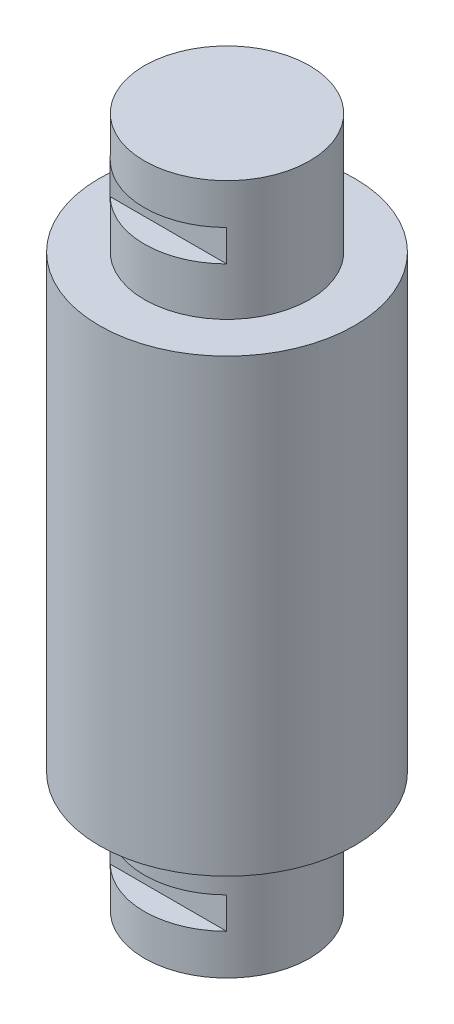
ISO-10303-21;
HEADER;
FILE_DESCRIPTION(('STEP AP214'),'2;1');
FILE_NAME('part.step','',(''),(''),'','','');
FILE_SCHEMA(('AUTOMOTIVE_DESIGN { 1 0 10303 214 1 1 1 1 }'));
ENDSEC;
DATA;
#1=APPLICATION_CONTEXT('core data for automotive mechanical design processes');
#2=APPLICATION_PROTOCOL_DEFINITION('international standard','automotive_design',2000,#1);
#3=PRODUCT_CONTEXT('',#1,'mechanical');
#4=PRODUCT('Part','Part','',(#3));
#5=PRODUCT_RELATED_PRODUCT_CATEGORY('part','',(#4));
#6=PRODUCT_DEFINITION_FORMATION('','',#4);
#7=PRODUCT_DEFINITION_CONTEXT('part definition',#1,'design');
#8=PRODUCT_DEFINITION('design','',#6,#7);
#9=PRODUCT_DEFINITION_SHAPE('','',#8);
#10=(LENGTH_UNIT() NAMED_UNIT(*) SI_UNIT(.MILLI.,.METRE.));
#11=(NAMED_UNIT(*) PLANE_ANGLE_UNIT() SI_UNIT($,.RADIAN.));
#12=(NAMED_UNIT(*) SI_UNIT($,.STERADIAN.) SOLID_ANGLE_UNIT());
#13=UNCERTAINTY_MEASURE_WITH_UNIT(LENGTH_MEASURE(1.E-05),#10,'distance_accuracy_value','');
#14=(GEOMETRIC_REPRESENTATION_CONTEXT(3) GLOBAL_UNCERTAINTY_ASSIGNED_CONTEXT((#13)) GLOBAL_UNIT_ASSIGNED_CONTEXT((#10,
#11,#12)) REPRESENTATION_CONTEXT('',''));
#15=CARTESIAN_POINT('',(0.,0.,0.));
#16=DIRECTION('',(0.,0.,1.));
#17=DIRECTION('',(1.,0.,0.));
#18=AXIS2_PLACEMENT_3D('',#15,#16,#17);
#19=CARTESIAN_POINT('',(0.,-115.,0.));
#20=DIRECTION('',(0.,1.,0.));
#21=DIRECTION('',(0.,0.,1.));
#22=AXIS2_PLACEMENT_3D('',#19,#20,#21);
#23=CYLINDRICAL_SURFACE('',#22,27.5);
#24=CARTESIAN_POINT('',(0.,-115.,0.));
#25=DIRECTION('',(0.,1.,0.));
#26=DIRECTION('',(0.,0.,1.));
#27=AXIS2_PLACEMENT_3D('',#24,#25,#26);
#28=CIRCLE('',#27,27.5);
#29=CARTESIAN_POINT('',(0.,-115.,27.5));
#30=VERTEX_POINT('',#29);
#31=EDGE_CURVE('E119',#30,#30,#28,.T.);
#32=ORIENTED_EDGE('',*,*,#31,.T.);
#33=EDGE_LOOP('',(#32));
#34=FACE_BOUND('',#33,.T.);
#35=CARTESIAN_POINT('',(0.,-75.,0.));
#36=DIRECTION('',(0.,1.,0.));
#37=DIRECTION('',(0.,0.,1.));
#38=AXIS2_PLACEMENT_3D('',#35,#36,#37);
#39=CIRCLE('',#38,27.5);
#40=CARTESIAN_POINT('',(0.,-75.,27.5));
#41=VERTEX_POINT('',#40);
#42=EDGE_CURVE('E122',#41,#41,#39,.T.);
#43=ORIENTED_EDGE('',*,*,#42,.F.);
#44=EDGE_LOOP('',(#43));
#45=FACE_BOUND('',#44,.T.);
#46=DIRECTION('',(0.,1.,0.));
#47=VECTOR('',#46,1.);
#48=CARTESIAN_POINT('',(-19.3907194296653,-115.,19.5));
#49=LINE('',#48,#47);
#50=CARTESIAN_POINT('',(-19.3907194296653,-101.5,19.5));
#51=VERTEX_POINT('',#50);
#52=CARTESIAN_POINT('',(-19.3907194296653,-91.,19.5));
#53=VERTEX_POINT('',#52);
#54=EDGE_CURVE('E83',#51,#53,#49,.T.);
#55=ORIENTED_EDGE('',*,*,#54,.T.);
#56=CARTESIAN_POINT('',(0.,-91.,0.));
#57=DIRECTION('',(0.,-1.,0.));
#58=DIRECTION('',(0.,0.,-1.));
#59=AXIS2_PLACEMENT_3D('',#56,#57,#58);
#60=CIRCLE('',#59,27.5);
#61=CARTESIAN_POINT('',(19.3907194296653,-91.,19.5));
#62=VERTEX_POINT('',#61);
#63=EDGE_CURVE('E11',#53,#62,#60,.F.);
#64=ORIENTED_EDGE('',*,*,#63,.T.);
#65=DIRECTION('',(0.,1.,0.));
#66=VECTOR('',#65,1.);
#67=CARTESIAN_POINT('',(19.3907194296653,-115.,19.5));
#68=LINE('',#67,#66);
#69=CARTESIAN_POINT('',(19.3907194296653,-101.5,19.5));
#70=VERTEX_POINT('',#69);
#71=EDGE_CURVE('E47',#62,#70,#68,.F.);
#72=ORIENTED_EDGE('',*,*,#71,.T.);
#73=CARTESIAN_POINT('',(0.,-101.5,0.));
#74=DIRECTION('',(0.,1.,0.));
#75=DIRECTION('',(0.,0.,1.));
#76=AXIS2_PLACEMENT_3D('',#73,#74,#75);
#77=CIRCLE('',#76,27.5);
#78=EDGE_CURVE('E78',#70,#51,#77,.F.);
#79=ORIENTED_EDGE('',*,*,#78,.T.);
#80=EDGE_LOOP('',(#55,#64,#72,#79));
#81=FACE_BOUND('',#80,.T.);
#82=ADVANCED_FACE('F39',(#34,#45,#81),#23,.T.);
#83=CARTESIAN_POINT('',(0.,75.,0.));
#84=DIRECTION('',(0.,-1.,0.));
#85=DIRECTION('',(0.,0.,-1.));
#86=AXIS2_PLACEMENT_3D('',#83,#84,#85);
#87=CYLINDRICAL_SURFACE('',#86,42.5);
#88=CARTESIAN_POINT('',(0.,75.,0.));
#89=DIRECTION('',(0.,1.,0.));
#90=DIRECTION('',(0.,0.,1.));
#91=AXIS2_PLACEMENT_3D('',#88,#89,#90);
#92=CIRCLE('',#91,42.5);
#93=CARTESIAN_POINT('',(0.,75.,42.5));
#94=VERTEX_POINT('',#93);
#95=EDGE_CURVE('E109',#94,#94,#92,.T.);
#96=ORIENTED_EDGE('',*,*,#95,.F.);
#97=EDGE_LOOP('',(#96));
#98=FACE_BOUND('',#97,.T.);
#99=CARTESIAN_POINT('',(0.,-75.,0.));
#100=DIRECTION('',(0.,1.,0.));
#101=DIRECTION('',(0.,0.,1.));
#102=AXIS2_PLACEMENT_3D('',#99,#100,#101);
#103=CIRCLE('',#102,42.5);
#104=CARTESIAN_POINT('',(0.,-75.,42.5));
#105=VERTEX_POINT('',#104);
#106=EDGE_CURVE('E106',#105,#105,#103,.T.);
#107=ORIENTED_EDGE('',*,*,#106,.T.);
#108=EDGE_LOOP('',(#107));
#109=FACE_BOUND('',#108,.T.);
#110=ADVANCED_FACE('F41',(#98,#109),#87,.T.);
#111=CARTESIAN_POINT('',(0.,75.,0.));
#112=DIRECTION('',(0.,1.,0.));
#113=DIRECTION('',(0.,0.,1.));
#114=AXIS2_PLACEMENT_3D('',#111,#112,#113);
#115=PLANE('',#114);
#116=CARTESIAN_POINT('',(0.,75.,0.));
#117=DIRECTION('',(0.,1.,0.));
#118=DIRECTION('',(0.,0.,1.));
#119=AXIS2_PLACEMENT_3D('',#116,#117,#118);
#120=CIRCLE('',#119,27.5);
#121=CARTESIAN_POINT('',(0.,75.,27.5));
#122=VERTEX_POINT('',#121);
#123=EDGE_CURVE('E105',#122,#122,#120,.T.);
#124=ORIENTED_EDGE('',*,*,#123,.F.);
#125=EDGE_LOOP('',(#124));
#126=FACE_BOUND('',#125,.T.);
#127=ORIENTED_EDGE('',*,*,#95,.T.);
#128=EDGE_LOOP('',(#127));
#129=FACE_BOUND('',#128,.T.);
#130=ADVANCED_FACE('F148',(#126,#129),#115,.T.);
#131=CARTESIAN_POINT('',(0.,-75.,0.));
#132=DIRECTION('',(0.,1.,0.));
#133=DIRECTION('',(0.,0.,1.));
#134=AXIS2_PLACEMENT_3D('',#131,#132,#133);
#135=PLANE('',#134);
#136=ORIENTED_EDGE('',*,*,#42,.T.);
#137=EDGE_LOOP('',(#136));
#138=FACE_BOUND('',#137,.T.);
#139=ORIENTED_EDGE('',*,*,#106,.F.);
#140=EDGE_LOOP('',(#139));
#141=FACE_BOUND('',#140,.T.);
#142=ADVANCED_FACE('F169',(#138,#141),#135,.F.);
#143=CARTESIAN_POINT('',(0.,115.,0.));
#144=DIRECTION('',(0.,-1.,0.));
#145=DIRECTION('',(0.,0.,-1.));
#146=AXIS2_PLACEMENT_3D('',#143,#144,#145);
#147=CYLINDRICAL_SURFACE('',#146,27.5);
#148=DIRECTION('',(0.,-1.,0.));
#149=VECTOR('',#148,1.);
#150=CARTESIAN_POINT('',(-19.3907194296653,115.,19.5));
#151=LINE('',#150,#149);
#152=CARTESIAN_POINT('',(-19.3907194296653,91.,19.5));
#153=VERTEX_POINT('',#152);
#154=CARTESIAN_POINT('',(-19.3907194296653,101.5,19.5));
#155=VERTEX_POINT('',#154);
#156=EDGE_CURVE('E99',#153,#155,#151,.F.);
#157=ORIENTED_EDGE('',*,*,#156,.T.);
#158=CARTESIAN_POINT('',(0.,101.5,0.));
#159=DIRECTION('',(0.,1.,0.));
#160=DIRECTION('',(0.,0.,1.));
#161=AXIS2_PLACEMENT_3D('',#158,#159,#160);
#162=CIRCLE('',#161,27.5);
#163=CARTESIAN_POINT('',(19.3907194296653,101.5,19.5));
#164=VERTEX_POINT('',#163);
#165=EDGE_CURVE('E84',#155,#164,#162,.T.);
#166=ORIENTED_EDGE('',*,*,#165,.T.);
#167=DIRECTION('',(0.,-1.,0.));
#168=VECTOR('',#167,1.);
#169=CARTESIAN_POINT('',(19.3907194296653,115.,19.5));
#170=LINE('',#169,#168);
#171=CARTESIAN_POINT('',(19.3907194296653,91.,19.5));
#172=VERTEX_POINT('',#171);
#173=EDGE_CURVE('E96',#164,#172,#170,.T.);
#174=ORIENTED_EDGE('',*,*,#173,.T.);
#175=CARTESIAN_POINT('',(0.,91.,0.));
#176=DIRECTION('',(0.,-1.,0.));
#177=DIRECTION('',(0.,0.,-1.));
#178=AXIS2_PLACEMENT_3D('',#175,#176,#177);
#179=CIRCLE('',#178,27.5);
#180=EDGE_CURVE('E102',#172,#153,#179,.T.);
#181=ORIENTED_EDGE('',*,*,#180,.T.);
#182=EDGE_LOOP('',(#157,#166,#174,#181));
#183=FACE_BOUND('',#182,.T.);
#184=CARTESIAN_POINT('',(0.,115.,0.));
#185=DIRECTION('',(0.,1.,0.));
#186=DIRECTION('',(0.,0.,1.));
#187=AXIS2_PLACEMENT_3D('',#184,#185,#186);
#188=CIRCLE('',#187,27.5);
#189=CARTESIAN_POINT('',(0.,115.,27.5));
#190=VERTEX_POINT('',#189);
#191=EDGE_CURVE('E110',#190,#190,#188,.T.);
#192=ORIENTED_EDGE('',*,*,#191,.F.);
#193=EDGE_LOOP('',(#192));
#194=FACE_BOUND('',#193,.T.);
#195=ORIENTED_EDGE('',*,*,#123,.T.);
#196=EDGE_LOOP('',(#195));
#197=FACE_BOUND('',#196,.T.);
#198=ADVANCED_FACE('F165',(#183,#194,#197),#147,.T.);
#199=CARTESIAN_POINT('',(0.,115.,0.));
#200=DIRECTION('',(0.,1.,0.));
#201=DIRECTION('',(0.,0.,1.));
#202=AXIS2_PLACEMENT_3D('',#199,#200,#201);
#203=PLANE('',#202);
#204=ORIENTED_EDGE('',*,*,#191,.T.);
#205=EDGE_LOOP('',(#204));
#206=FACE_BOUND('',#205,.T.);
#207=ADVANCED_FACE('F157',(#206),#203,.T.);
#208=CARTESIAN_POINT('',(-42.5,101.5,27.5));
#209=DIRECTION('',(0.,1.,0.));
#210=DIRECTION('',(0.,0.,1.));
#211=AXIS2_PLACEMENT_3D('',#208,#209,#210);
#212=PLANE('',#211);
#213=DIRECTION('',(1.,0.,0.));
#214=VECTOR('',#213,1.);
#215=CARTESIAN_POINT('',(-42.5,101.5,19.5));
#216=LINE('',#215,#214);
#217=EDGE_CURVE('E117',#155,#164,#216,.T.);
#218=ORIENTED_EDGE('',*,*,#217,.T.);
#219=ORIENTED_EDGE('',*,*,#165,.F.);
#220=EDGE_LOOP('',(#218,#219));
#221=FACE_BOUND('',#220,.T.);
#222=ADVANCED_FACE('F153',(#221),#212,.F.);
#223=CARTESIAN_POINT('',(-42.5,91.,19.5));
#224=DIRECTION('',(0.,0.,-1.));
#225=DIRECTION('',(-1.,0.,0.));
#226=AXIS2_PLACEMENT_3D('',#223,#224,#225);
#227=PLANE('',#226);
#228=ORIENTED_EDGE('',*,*,#217,.F.);
#229=ORIENTED_EDGE('',*,*,#156,.F.);
#230=DIRECTION('',(1.,0.,0.));
#231=VECTOR('',#230,1.);
#232=CARTESIAN_POINT('',(-42.5,91.,19.5));
#233=LINE('',#232,#231);
#234=EDGE_CURVE('E60',#153,#172,#233,.T.);
#235=ORIENTED_EDGE('',*,*,#234,.T.);
#236=ORIENTED_EDGE('',*,*,#173,.F.);
#237=EDGE_LOOP('',(#228,#229,#235,#236));
#238=FACE_BOUND('',#237,.T.);
#239=ADVANCED_FACE('F156',(#238),#227,.F.);
#240=CARTESIAN_POINT('',(-42.5,91.,27.5));
#241=DIRECTION('',(0.,-1.,0.));
#242=DIRECTION('',(0.,0.,-1.));
#243=AXIS2_PLACEMENT_3D('',#240,#241,#242);
#244=PLANE('',#243);
#245=ORIENTED_EDGE('',*,*,#234,.F.);
#246=ORIENTED_EDGE('',*,*,#180,.F.);
#247=EDGE_LOOP('',(#245,#246));
#248=FACE_BOUND('',#247,.T.);
#249=ADVANCED_FACE('F137',(#248),#244,.F.);
#250=CARTESIAN_POINT('',(0.,-115.,0.));
#251=DIRECTION('',(0.,-1.,0.));
#252=DIRECTION('',(0.,0.,1.));
#253=AXIS2_PLACEMENT_3D('',#250,#251,#252);
#254=PLANE('',#253);
#255=ORIENTED_EDGE('',*,*,#31,.F.);
#256=EDGE_LOOP('',(#255));
#257=FACE_BOUND('',#256,.T.);
#258=ADVANCED_FACE('F130',(#257),#254,.T.);
#259=CARTESIAN_POINT('',(-42.5,-91.,27.5));
#260=DIRECTION('',(0.,-1.,0.));
#261=DIRECTION('',(0.,0.,-1.));
#262=AXIS2_PLACEMENT_3D('',#259,#260,#261);
#263=PLANE('',#262);
#264=DIRECTION('',(1.,0.,0.));
#265=VECTOR('',#264,1.);
#266=CARTESIAN_POINT('',(-42.5,-91.,19.5));
#267=LINE('',#266,#265);
#268=EDGE_CURVE('E90',#53,#62,#267,.T.);
#269=ORIENTED_EDGE('',*,*,#268,.T.);
#270=ORIENTED_EDGE('',*,*,#63,.F.);
#271=EDGE_LOOP('',(#269,#270));
#272=FACE_BOUND('',#271,.T.);
#273=ADVANCED_FACE('F128',(#272),#263,.T.);
#274=CARTESIAN_POINT('',(-42.5,-91.,19.5));
#275=DIRECTION('',(0.,0.,1.));
#276=DIRECTION('',(1.,0.,0.));
#277=AXIS2_PLACEMENT_3D('',#274,#275,#276);
#278=PLANE('',#277);
#279=ORIENTED_EDGE('',*,*,#268,.F.);
#280=ORIENTED_EDGE('',*,*,#54,.F.);
#281=DIRECTION('',(1.,0.,0.));
#282=VECTOR('',#281,1.);
#283=CARTESIAN_POINT('',(-42.5,-101.5,19.5));
#284=LINE('',#283,#282);
#285=EDGE_CURVE('E53',#51,#70,#284,.T.);
#286=ORIENTED_EDGE('',*,*,#285,.T.);
#287=ORIENTED_EDGE('',*,*,#71,.F.);
#288=EDGE_LOOP('',(#279,#280,#286,#287));
#289=FACE_BOUND('',#288,.T.);
#290=ADVANCED_FACE('F88',(#289),#278,.T.);
#291=CARTESIAN_POINT('',(-42.5,-101.5,19.5));
#292=DIRECTION('',(0.,1.,0.));
#293=DIRECTION('',(0.,0.,1.));
#294=AXIS2_PLACEMENT_3D('',#291,#292,#293);
#295=PLANE('',#294);
#296=ORIENTED_EDGE('',*,*,#285,.F.);
#297=ORIENTED_EDGE('',*,*,#78,.F.);
#298=EDGE_LOOP('',(#296,#297));
#299=FACE_BOUND('',#298,.T.);
#300=ADVANCED_FACE('F79',(#299),#295,.T.);
#301=CLOSED_SHELL('',(#82,#110,#130,#142,#198,#207,#222,#239,#249,#258,#273,#290,#300));
#302=MANIFOLD_SOLID_BREP('B2',#301);
#303=ADVANCED_BREP_SHAPE_REPRESENTATION('',(#18,#302),#14);
#304=SHAPE_DEFINITION_REPRESENTATION(#9,#303);
ENDSEC;
END-ISO-10303-21;
